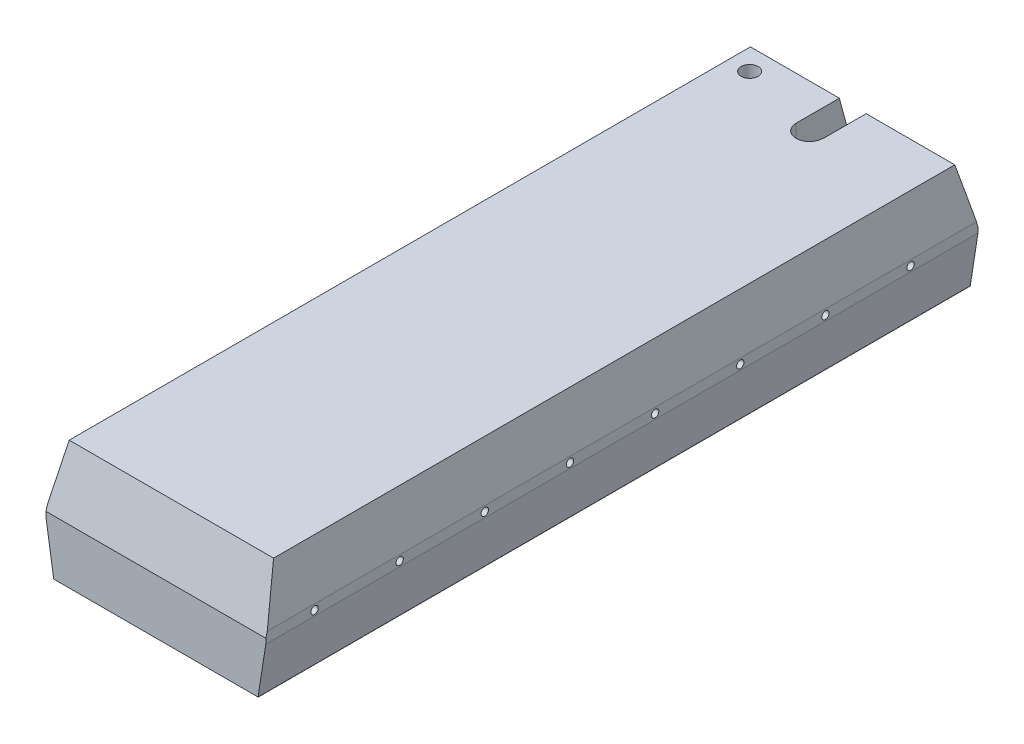
ISO-10303-21;
HEADER;
FILE_DESCRIPTION(('STEP AP214'),'2;1');
FILE_NAME('part.step','',(''),(''),'','','');
FILE_SCHEMA(('AUTOMOTIVE_DESIGN { 1 0 10303 214 1 1 1 1 }'));
ENDSEC;
DATA;
#1=APPLICATION_CONTEXT('core data for automotive mechanical design processes');
#2=APPLICATION_PROTOCOL_DEFINITION('international standard','automotive_design',2000,#1);
#3=PRODUCT_CONTEXT('',#1,'mechanical');
#4=PRODUCT('Part','Part','',(#3));
#5=PRODUCT_RELATED_PRODUCT_CATEGORY('part','',(#4));
#6=PRODUCT_DEFINITION_FORMATION('','',#4);
#7=PRODUCT_DEFINITION_CONTEXT('part definition',#1,'design');
#8=PRODUCT_DEFINITION('design','',#6,#7);
#9=PRODUCT_DEFINITION_SHAPE('','',#8);
#10=(LENGTH_UNIT() NAMED_UNIT(*) SI_UNIT(.MILLI.,.METRE.));
#11=(NAMED_UNIT(*) PLANE_ANGLE_UNIT() SI_UNIT($,.RADIAN.));
#12=(NAMED_UNIT(*) SI_UNIT($,.STERADIAN.) SOLID_ANGLE_UNIT());
#13=UNCERTAINTY_MEASURE_WITH_UNIT(LENGTH_MEASURE(1.E-05),#10,'distance_accuracy_value','');
#14=(GEOMETRIC_REPRESENTATION_CONTEXT(3) GLOBAL_UNCERTAINTY_ASSIGNED_CONTEXT((#13)) GLOBAL_UNIT_ASSIGNED_CONTEXT((#10,
#11,#12)) REPRESENTATION_CONTEXT('',''));
#15=CARTESIAN_POINT('',(0.,0.,0.));
#16=DIRECTION('',(0.,0.,1.));
#17=DIRECTION('',(1.,0.,0.));
#18=AXIS2_PLACEMENT_3D('',#15,#16,#17);
#19=CARTESIAN_POINT('',(1.7265748977661,5.79398536682129,-17.3326766490936));
#20=DIRECTION('',(0.,1.,0.));
#21=DIRECTION('',(0.,0.,1.));
#22=AXIS2_PLACEMENT_3D('',#19,#20,#21);
#23=PLANE('',#22);
#24=CARTESIAN_POINT('',(1.7265748977661,5.79398536682129,-17.3326766490936));
#25=DIRECTION('',(0.,-1.,0.));
#26=DIRECTION('',(0.,0.,-1.));
#27=AXIS2_PLACEMENT_3D('',#24,#25,#26);
#28=CIRCLE('',#27,0.499999999999999);
#29=CARTESIAN_POINT('',(1.7265748977661,5.79398536682129,-17.8326766490936));
#30=VERTEX_POINT('',#29);
#31=EDGE_CURVE('E20',#30,#30,#28,.F.);
#32=ORIENTED_EDGE('',*,*,#31,.T.);
#33=EDGE_LOOP('',(#32));
#34=FACE_BOUND('',#33,.T.);
#35=ADVANCED_FACE('F17',(#34),#23,.T.);
#36=CARTESIAN_POINT('',(7.28615480415629,6.79398536682129,-16.0697424411774));
#37=DIRECTION('',(0.,0.,1.));
#38=DIRECTION('',(1.,0.,0.));
#39=AXIS2_PLACEMENT_3D('',#36,#37,#38);
#40=PLANE('',#39);
#41=DIRECTION('',(0.,-1.,0.));
#42=VECTOR('',#41,1.);
#43=CARTESIAN_POINT('',(7.2768995712719,6.79398536682129,-16.0697424411774));
#44=LINE('',#43,#42);
#45=CARTESIAN_POINT('',(7.2768995712719,4.79398536682129,-16.0697424411774));
#46=VERTEX_POINT('',#45);
#47=CARTESIAN_POINT('',(7.2768995712719,6.79398536682129,-16.0697424411774));
#48=VERTEX_POINT('',#47);
#49=EDGE_CURVE('E142',#46,#48,#44,.F.);
#50=ORIENTED_EDGE('',*,*,#49,.T.);
#51=DIRECTION('',(1.,0.,0.));
#52=VECTOR('',#51,1.);
#53=CARTESIAN_POINT('',(7.28615480415629,6.79398536682129,-16.0697424411774));
#54=LINE('',#53,#52);
#55=CARTESIAN_POINT('',(7.29541003704069,6.79398536682129,-16.0697424411774));
#56=VERTEX_POINT('',#55);
#57=EDGE_CURVE('E185',#56,#48,#54,.F.);
#58=ORIENTED_EDGE('',*,*,#57,.F.);
#59=DIRECTION('',(0.,1.,0.));
#60=VECTOR('',#59,1.);
#61=CARTESIAN_POINT('',(7.29541003704069,6.79398536682129,-16.0697424411774));
#62=LINE('',#61,#60);
#63=CARTESIAN_POINT('',(7.29541003704069,4.79398536682129,-16.0697424411774));
#64=VERTEX_POINT('',#63);
#65=EDGE_CURVE('E145',#56,#64,#62,.F.);
#66=ORIENTED_EDGE('',*,*,#65,.T.);
#67=DIRECTION('',(1.,0.,0.));
#68=VECTOR('',#67,1.);
#69=CARTESIAN_POINT('',(6.50874662313626,4.79398536682129,-16.0697424411774));
#70=LINE('',#69,#68);
#71=EDGE_CURVE('E139',#46,#64,#70,.T.);
#72=ORIENTED_EDGE('',*,*,#71,.F.);
#73=EDGE_LOOP('',(#50,#58,#66,#72));
#74=FACE_BOUND('',#73,.T.);
#75=ADVANCED_FACE('F140',(#74),#40,.F.);
#76=CARTESIAN_POINT('',(6.50874662313626,4.79398536682129,-18.8628559020372));
#77=DIRECTION('',(0.,1.,0.));
#78=DIRECTION('',(0.,0.,1.));
#79=AXIS2_PLACEMENT_3D('',#76,#77,#78);
#80=PLANE('',#79);
#81=ORIENTED_EDGE('',*,*,#71,.T.);
#82=DIRECTION('',(0.,0.,-1.));
#83=VECTOR('',#82,1.);
#84=CARTESIAN_POINT('',(7.29541003704069,4.79398536682129,-19.0966314077377));
#85=LINE('',#84,#83);
#86=CARTESIAN_POINT('',(7.29541003704069,4.79398536682129,-19.1420509193472));
#87=VERTEX_POINT('',#86);
#88=EDGE_CURVE('E192',#64,#87,#85,.T.);
#89=ORIENTED_EDGE('',*,*,#88,.T.);
#90=DIRECTION('',(1.,0.,0.));
#91=VECTOR('',#90,1.);
#92=CARTESIAN_POINT('',(6.50874662313626,4.79398536682129,-19.1420509193472));
#93=LINE('',#92,#91);
#94=CARTESIAN_POINT('',(5.72310042872811,4.79398536682128,-19.1420509193472));
#95=VERTEX_POINT('',#94);
#96=EDGE_CURVE('E148',#87,#95,#93,.F.);
#97=ORIENTED_EDGE('',*,*,#96,.T.);
#98=DIRECTION('',(0.,0.,1.));
#99=VECTOR('',#98,1.);
#100=CARTESIAN_POINT('',(5.72310042872811,4.79398536682129,-19.0966314077377));
#101=LINE('',#100,#99);
#102=CARTESIAN_POINT('',(5.72310042872811,4.79398536682129,-16.0697424411774));
#103=VERTEX_POINT('',#102);
#104=EDGE_CURVE('E133',#95,#103,#101,.T.);
#105=ORIENTED_EDGE('',*,*,#104,.T.);
#106=CARTESIAN_POINT('',(6.5,4.79398536682129,-16.0697424411774));
#107=DIRECTION('',(0.,-1.,0.));
#108=DIRECTION('',(0.,0.,-1.));
#109=AXIS2_PLACEMENT_3D('',#106,#107,#108);
#110=CIRCLE('',#109,0.776899571271895);
#111=EDGE_CURVE('E150',#103,#46,#110,.F.);
#112=ORIENTED_EDGE('',*,*,#111,.T.);
#113=EDGE_LOOP('',(#81,#89,#97,#105,#112));
#114=FACE_BOUND('',#113,.T.);
#115=ADVANCED_FACE('F151',(#114),#80,.T.);
#116=CARTESIAN_POINT('',(-44.2885988895638,3.4006376749442,14.4430922391916));
#117=DIRECTION('',(1.,0.,0.));
#118=DIRECTION('',(0.,0.,-1.));
#119=AXIS2_PLACEMENT_3D('',#116,#117,#118);
#120=CYLINDRICAL_SURFACE('',#119,0.217699812941596);
#121=CARTESIAN_POINT('',(0.0470726490020903,3.4006376749442,14.4430922391916));
#122=DIRECTION('',(1.,0.,0.));
#123=DIRECTION('',(0.,0.,-1.));
#124=AXIS2_PLACEMENT_3D('',#121,#122,#123);
#125=CIRCLE('',#124,0.217699812941596);
#126=CARTESIAN_POINT('',(0.0470726490020903,3.4006376749442,14.22539242625));
#127=VERTEX_POINT('',#126);
#128=EDGE_CURVE('E196',#127,#127,#125,.F.);
#129=ORIENTED_EDGE('',*,*,#128,.T.);
#130=EDGE_LOOP('',(#129));
#131=FACE_BOUND('',#130,.T.);
#132=CARTESIAN_POINT('',(12.9529273509979,3.4006376749442,14.4430922391916));
#133=DIRECTION('',(1.,0.,0.));
#134=DIRECTION('',(0.,0.,-1.));
#135=AXIS2_PLACEMENT_3D('',#132,#133,#134);
#136=CIRCLE('',#135,0.217699812941596);
#137=CARTESIAN_POINT('',(12.9529273509979,3.4006376749442,14.22539242625));
#138=VERTEX_POINT('',#137);
#139=EDGE_CURVE('E239',#138,#138,#136,.T.);
#140=ORIENTED_EDGE('',*,*,#139,.T.);
#141=EDGE_LOOP('',(#140));
#142=FACE_BOUND('',#141,.T.);
#143=ADVANCED_FACE('F267',(#131,#142),#120,.F.);
#144=CARTESIAN_POINT('',(-44.2885988895638,3.4006376749442,4.44309223919162));
#145=DIRECTION('',(1.,0.,0.));
#146=DIRECTION('',(0.,0.,-1.));
#147=AXIS2_PLACEMENT_3D('',#144,#145,#146);
#148=CYLINDRICAL_SURFACE('',#147,0.217699812941596);
#149=CARTESIAN_POINT('',(0.0470726490020903,3.4006376749442,4.44309223919162));
#150=DIRECTION('',(1.,0.,0.));
#151=DIRECTION('',(0.,0.,-1.));
#152=AXIS2_PLACEMENT_3D('',#149,#150,#151);
#153=CIRCLE('',#152,0.217699812941596);
#154=CARTESIAN_POINT('',(0.0470726490020903,3.4006376749442,4.22539242625002));
#155=VERTEX_POINT('',#154);
#156=EDGE_CURVE('E261',#155,#155,#153,.F.);
#157=ORIENTED_EDGE('',*,*,#156,.T.);
#158=EDGE_LOOP('',(#157));
#159=FACE_BOUND('',#158,.T.);
#160=CARTESIAN_POINT('',(12.9529273509979,3.4006376749442,4.44309223919162));
#161=DIRECTION('',(1.,0.,0.));
#162=DIRECTION('',(0.,0.,-1.));
#163=AXIS2_PLACEMENT_3D('',#160,#161,#162);
#164=CIRCLE('',#163,0.217699812941596);
#165=CARTESIAN_POINT('',(12.9529273509979,3.4006376749442,4.22539242625002));
#166=VERTEX_POINT('',#165);
#167=EDGE_CURVE('E236',#166,#166,#164,.T.);
#168=ORIENTED_EDGE('',*,*,#167,.T.);
#169=EDGE_LOOP('',(#168));
#170=FACE_BOUND('',#169,.T.);
#171=ADVANCED_FACE('F469',(#159,#170),#148,.F.);
#172=CARTESIAN_POINT('',(-44.2885988895638,3.4006376749442,-5.55690776080839));
#173=DIRECTION('',(1.,0.,0.));
#174=DIRECTION('',(0.,0.,-1.));
#175=AXIS2_PLACEMENT_3D('',#172,#173,#174);
#176=CYLINDRICAL_SURFACE('',#175,0.217699812941596);
#177=CARTESIAN_POINT('',(0.0470726490020903,3.4006376749442,-5.55690776080839));
#178=DIRECTION('',(1.,0.,0.));
#179=DIRECTION('',(0.,0.,-1.));
#180=AXIS2_PLACEMENT_3D('',#177,#178,#179);
#181=CIRCLE('',#180,0.217699812941596);
#182=CARTESIAN_POINT('',(0.0470726490020903,3.4006376749442,-5.77460757374999));
#183=VERTEX_POINT('',#182);
#184=EDGE_CURVE('E258',#183,#183,#181,.F.);
#185=ORIENTED_EDGE('',*,*,#184,.T.);
#186=EDGE_LOOP('',(#185));
#187=FACE_BOUND('',#186,.T.);
#188=CARTESIAN_POINT('',(12.9529273509979,3.4006376749442,-5.55690776080839));
#189=DIRECTION('',(1.,0.,0.));
#190=DIRECTION('',(0.,0.,-1.));
#191=AXIS2_PLACEMENT_3D('',#188,#189,#190);
#192=CIRCLE('',#191,0.217699812941596);
#193=CARTESIAN_POINT('',(12.9529273509979,3.4006376749442,-5.77460757374999));
#194=VERTEX_POINT('',#193);
#195=EDGE_CURVE('E233',#194,#194,#192,.T.);
#196=ORIENTED_EDGE('',*,*,#195,.T.);
#197=EDGE_LOOP('',(#196));
#198=FACE_BOUND('',#197,.T.);
#199=ADVANCED_FACE('F465',(#187,#198),#176,.F.);
#200=CARTESIAN_POINT('',(-44.2885988895638,3.4006376749442,-15.5569077608084));
#201=DIRECTION('',(1.,0.,0.));
#202=DIRECTION('',(0.,0.,-1.));
#203=AXIS2_PLACEMENT_3D('',#200,#201,#202);
#204=CYLINDRICAL_SURFACE('',#203,0.217699812941596);
#205=CARTESIAN_POINT('',(0.0470726490020903,3.4006376749442,-15.5569077608084));
#206=DIRECTION('',(1.,0.,0.));
#207=DIRECTION('',(0.,0.,-1.));
#208=AXIS2_PLACEMENT_3D('',#205,#206,#207);
#209=CIRCLE('',#208,0.217699812941596);
#210=CARTESIAN_POINT('',(0.0470726490020903,3.4006376749442,-15.77460757375));
#211=VERTEX_POINT('',#210);
#212=EDGE_CURVE('E255',#211,#211,#209,.F.);
#213=ORIENTED_EDGE('',*,*,#212,.T.);
#214=EDGE_LOOP('',(#213));
#215=FACE_BOUND('',#214,.T.);
#216=CARTESIAN_POINT('',(12.9529273509979,3.4006376749442,-15.5569077608084));
#217=DIRECTION('',(1.,0.,0.));
#218=DIRECTION('',(0.,0.,-1.));
#219=AXIS2_PLACEMENT_3D('',#216,#217,#218);
#220=CIRCLE('',#219,0.217699812941596);
#221=CARTESIAN_POINT('',(12.9529273509979,3.4006376749442,-15.77460757375));
#222=VERTEX_POINT('',#221);
#223=EDGE_CURVE('E230',#222,#222,#220,.T.);
#224=ORIENTED_EDGE('',*,*,#223,.T.);
#225=EDGE_LOOP('',(#224));
#226=FACE_BOUND('',#225,.T.);
#227=ADVANCED_FACE('F461',(#215,#226),#204,.F.);
#228=CARTESIAN_POINT('',(-44.2885988895638,3.4006376749442,-10.5569077608084));
#229=DIRECTION('',(1.,0.,0.));
#230=DIRECTION('',(0.,0.,-1.));
#231=AXIS2_PLACEMENT_3D('',#228,#229,#230);
#232=CYLINDRICAL_SURFACE('',#231,0.217699812941596);
#233=CARTESIAN_POINT('',(0.0470726490020903,3.4006376749442,-10.5569077608084));
#234=DIRECTION('',(1.,0.,0.));
#235=DIRECTION('',(0.,0.,-1.));
#236=AXIS2_PLACEMENT_3D('',#233,#234,#235);
#237=CIRCLE('',#236,0.217699812941596);
#238=CARTESIAN_POINT('',(0.0470726490020903,3.4006376749442,-10.77460757375));
#239=VERTEX_POINT('',#238);
#240=EDGE_CURVE('E252',#239,#239,#237,.F.);
#241=ORIENTED_EDGE('',*,*,#240,.T.);
#242=EDGE_LOOP('',(#241));
#243=FACE_BOUND('',#242,.T.);
#244=CARTESIAN_POINT('',(12.9529273509979,3.4006376749442,-10.5569077608084));
#245=DIRECTION('',(1.,0.,0.));
#246=DIRECTION('',(0.,0.,-1.));
#247=AXIS2_PLACEMENT_3D('',#244,#245,#246);
#248=CIRCLE('',#247,0.217699812941596);
#249=CARTESIAN_POINT('',(12.9529273509979,3.4006376749442,-10.77460757375));
#250=VERTEX_POINT('',#249);
#251=EDGE_CURVE('E227',#250,#250,#248,.T.);
#252=ORIENTED_EDGE('',*,*,#251,.T.);
#253=EDGE_LOOP('',(#252));
#254=FACE_BOUND('',#253,.T.);
#255=ADVANCED_FACE('F457',(#243,#254),#232,.F.);
#256=CARTESIAN_POINT('',(-44.2885988895638,3.4006376749442,-0.556907760808385));
#257=DIRECTION('',(1.,0.,0.));
#258=DIRECTION('',(0.,0.,-1.));
#259=AXIS2_PLACEMENT_3D('',#256,#257,#258);
#260=CYLINDRICAL_SURFACE('',#259,0.217699812941596);
#261=CARTESIAN_POINT('',(0.0470726490020903,3.4006376749442,-0.556907760808385));
#262=DIRECTION('',(1.,0.,0.));
#263=DIRECTION('',(0.,0.,-1.));
#264=AXIS2_PLACEMENT_3D('',#261,#262,#263);
#265=CIRCLE('',#264,0.217699812941596);
#266=CARTESIAN_POINT('',(0.0470726490020903,3.4006376749442,-0.774607573749981));
#267=VERTEX_POINT('',#266);
#268=EDGE_CURVE('E249',#267,#267,#265,.F.);
#269=ORIENTED_EDGE('',*,*,#268,.T.);
#270=EDGE_LOOP('',(#269));
#271=FACE_BOUND('',#270,.T.);
#272=CARTESIAN_POINT('',(12.9529273509979,3.4006376749442,-0.556907760808385));
#273=DIRECTION('',(1.,0.,0.));
#274=DIRECTION('',(0.,0.,-1.));
#275=AXIS2_PLACEMENT_3D('',#272,#273,#274);
#276=CIRCLE('',#275,0.217699812941596);
#277=CARTESIAN_POINT('',(12.9529273509979,3.4006376749442,-0.774607573749981));
#278=VERTEX_POINT('',#277);
#279=EDGE_CURVE('E224',#278,#278,#276,.T.);
#280=ORIENTED_EDGE('',*,*,#279,.T.);
#281=EDGE_LOOP('',(#280));
#282=FACE_BOUND('',#281,.T.);
#283=ADVANCED_FACE('F453',(#271,#282),#260,.F.);
#284=CARTESIAN_POINT('',(-44.2885988895638,3.4006376749442,9.44309223919162));
#285=DIRECTION('',(1.,0.,0.));
#286=DIRECTION('',(0.,0.,-1.));
#287=AXIS2_PLACEMENT_3D('',#284,#285,#286);
#288=CYLINDRICAL_SURFACE('',#287,0.217699812941596);
#289=CARTESIAN_POINT('',(0.0470726490020903,3.4006376749442,9.44309223919162));
#290=DIRECTION('',(1.,0.,0.));
#291=DIRECTION('',(0.,0.,-1.));
#292=AXIS2_PLACEMENT_3D('',#289,#290,#291);
#293=CIRCLE('',#292,0.217699812941596);
#294=CARTESIAN_POINT('',(0.0470726490020903,3.4006376749442,9.22539242625002));
#295=VERTEX_POINT('',#294);
#296=EDGE_CURVE('E246',#295,#295,#293,.F.);
#297=ORIENTED_EDGE('',*,*,#296,.T.);
#298=EDGE_LOOP('',(#297));
#299=FACE_BOUND('',#298,.T.);
#300=CARTESIAN_POINT('',(12.9529273509979,3.4006376749442,9.44309223919162));
#301=DIRECTION('',(1.,0.,0.));
#302=DIRECTION('',(0.,0.,-1.));
#303=AXIS2_PLACEMENT_3D('',#300,#301,#302);
#304=CIRCLE('',#303,0.217699812941596);
#305=CARTESIAN_POINT('',(12.9529273509979,3.4006376749442,9.22539242625002));
#306=VERTEX_POINT('',#305);
#307=EDGE_CURVE('E221',#306,#306,#304,.T.);
#308=ORIENTED_EDGE('',*,*,#307,.T.);
#309=EDGE_LOOP('',(#308));
#310=FACE_BOUND('',#309,.T.);
#311=ADVANCED_FACE('F449',(#299,#310),#288,.F.);
#312=CARTESIAN_POINT('',(-44.2885988895638,3.4006376749442,19.4430922391916));
#313=DIRECTION('',(1.,0.,0.));
#314=DIRECTION('',(0.,0.,-1.));
#315=AXIS2_PLACEMENT_3D('',#312,#313,#314);
#316=CYLINDRICAL_SURFACE('',#315,0.217699812941596);
#317=CARTESIAN_POINT('',(0.0470726490020903,3.4006376749442,19.4430922391916));
#318=DIRECTION('',(1.,0.,0.));
#319=DIRECTION('',(0.,0.,-1.));
#320=AXIS2_PLACEMENT_3D('',#317,#318,#319);
#321=CIRCLE('',#320,0.217699812941596);
#322=CARTESIAN_POINT('',(0.0470726490020903,3.4006376749442,19.22539242625));
#323=VERTEX_POINT('',#322);
#324=EDGE_CURVE('E243',#323,#323,#321,.F.);
#325=ORIENTED_EDGE('',*,*,#324,.T.);
#326=EDGE_LOOP('',(#325));
#327=FACE_BOUND('',#326,.T.);
#328=CARTESIAN_POINT('',(12.9529273509979,3.4006376749442,19.4430922391916));
#329=DIRECTION('',(1.,0.,0.));
#330=DIRECTION('',(0.,0.,-1.));
#331=AXIS2_PLACEMENT_3D('',#328,#329,#330);
#332=CIRCLE('',#331,0.217699812941596);
#333=CARTESIAN_POINT('',(12.9529273509979,3.4006376749442,19.22539242625));
#334=VERTEX_POINT('',#333);
#335=EDGE_CURVE('E217',#334,#334,#332,.T.);
#336=ORIENTED_EDGE('',*,*,#335,.T.);
#337=EDGE_LOOP('',(#336));
#338=FACE_BOUND('',#337,.T.);
#339=ADVANCED_FACE('F445',(#327,#338),#316,.F.);
#340=CARTESIAN_POINT('',(1.7265748977661,6.79398536682129,-17.3326766490936));
#341=DIRECTION('',(0.,-1.,0.));
#342=DIRECTION('',(0.,0.,-1.));
#343=AXIS2_PLACEMENT_3D('',#340,#341,#342);
#344=CYLINDRICAL_SURFACE('',#343,0.499999999999999);
#345=CARTESIAN_POINT('',(1.7265748977661,6.79398536682129,-17.3326766490936));
#346=DIRECTION('',(0.,-1.,0.));
#347=DIRECTION('',(0.,0.,-1.));
#348=AXIS2_PLACEMENT_3D('',#345,#346,#347);
#349=CIRCLE('',#348,0.499999999999999);
#350=CARTESIAN_POINT('',(1.7265748977661,6.79398536682129,-17.8326766490936));
#351=VERTEX_POINT('',#350);
#352=EDGE_CURVE('E212',#351,#351,#349,.T.);
#353=ORIENTED_EDGE('',*,*,#352,.F.);
#354=EDGE_LOOP('',(#353));
#355=FACE_BOUND('',#354,.T.);
#356=ORIENTED_EDGE('',*,*,#31,.F.);
#357=EDGE_LOOP('',(#356));
#358=FACE_BOUND('',#357,.T.);
#359=ADVANCED_FACE('F440',(#355,#358),#344,.F.);
#360=CARTESIAN_POINT('',(6.5,6.79398536682129,-16.0697424411774));
#361=DIRECTION('',(0.,-1.,0.));
#362=DIRECTION('',(0.,0.,-1.));
#363=AXIS2_PLACEMENT_3D('',#360,#361,#362);
#364=CYLINDRICAL_SURFACE('',#363,0.776899571271895);
#365=DIRECTION('',(0.,1.,0.));
#366=VECTOR('',#365,1.);
#367=CARTESIAN_POINT('',(5.72310042872811,6.79398536682129,-16.0697424411774));
#368=LINE('',#367,#366);
#369=CARTESIAN_POINT('',(5.72310042872811,6.79398536682129,-16.0697424411774));
#370=VERTEX_POINT('',#369);
#371=EDGE_CURVE('E163',#103,#370,#368,.T.);
#372=ORIENTED_EDGE('',*,*,#371,.T.);
#373=CARTESIAN_POINT('',(6.5,6.79398536682129,-16.0697424411774));
#374=DIRECTION('',(0.,-1.,0.));
#375=DIRECTION('',(0.,0.,-1.));
#376=AXIS2_PLACEMENT_3D('',#373,#374,#375);
#377=CIRCLE('',#376,0.776899571271895);
#378=EDGE_CURVE('E156',#48,#370,#377,.T.);
#379=ORIENTED_EDGE('',*,*,#378,.F.);
#380=ORIENTED_EDGE('',*,*,#49,.F.);
#381=ORIENTED_EDGE('',*,*,#111,.F.);
#382=EDGE_LOOP('',(#372,#379,#380,#381));
#383=FACE_BOUND('',#382,.T.);
#384=ADVANCED_FACE('F154',(#383),#364,.F.);
#385=CARTESIAN_POINT('',(5.72310042872811,6.79398536682129,-19.0966314077377));
#386=DIRECTION('',(-1.,0.,0.));
#387=DIRECTION('',(0.,0.,1.));
#388=AXIS2_PLACEMENT_3D('',#385,#386,#387);
#389=PLANE('',#388);
#390=DIRECTION('',(0.,0.,1.));
#391=VECTOR('',#390,1.);
#392=CARTESIAN_POINT('',(5.72310042872811,6.79398536682129,1.3938474655151));
#393=LINE('',#392,#391);
#394=CARTESIAN_POINT('',(5.72310042872811,6.79398536682129,-18.6061525344849));
#395=VERTEX_POINT('',#394);
#396=EDGE_CURVE('E215',#370,#395,#393,.F.);
#397=ORIENTED_EDGE('',*,*,#396,.F.);
#398=ORIENTED_EDGE('',*,*,#371,.F.);
#399=ORIENTED_EDGE('',*,*,#104,.F.);
#400=DIRECTION('',(0.,0.965925826289067,0.258819045102525));
#401=VECTOR('',#400,1.);
#402=CARTESIAN_POINT('',(5.72310042872811,5.09731152088274,-19.0607749213231));
#403=LINE('',#402,#401);
#404=EDGE_CURVE('E165',#395,#95,#403,.F.);
#405=ORIENTED_EDGE('',*,*,#404,.F.);
#406=EDGE_LOOP('',(#397,#398,#399,#405));
#407=FACE_BOUND('',#406,.T.);
#408=ADVANCED_FACE('F284',(#407),#389,.F.);
#409=CARTESIAN_POINT('',(7.29541003704069,6.79398536682129,-19.0966314077377));
#410=DIRECTION('',(1.,0.,0.));
#411=DIRECTION('',(0.,0.,-1.));
#412=AXIS2_PLACEMENT_3D('',#409,#410,#411);
#413=PLANE('',#412);
#414=ORIENTED_EDGE('',*,*,#88,.F.);
#415=ORIENTED_EDGE('',*,*,#65,.F.);
#416=DIRECTION('',(0.,0.,1.));
#417=VECTOR('',#416,1.);
#418=CARTESIAN_POINT('',(7.29541003704069,6.79398536682129,1.3938474655151));
#419=LINE('',#418,#417);
#420=CARTESIAN_POINT('',(7.29541003704069,6.79398536682129,-18.6061525344849));
#421=VERTEX_POINT('',#420);
#422=EDGE_CURVE('E204',#421,#56,#419,.T.);
#423=ORIENTED_EDGE('',*,*,#422,.F.);
#424=DIRECTION('',(0.,0.965925826289067,0.258819045102525));
#425=VECTOR('',#424,1.);
#426=CARTESIAN_POINT('',(7.29541003704069,5.09731152088274,-19.0607749213231));
#427=LINE('',#426,#425);
#428=EDGE_CURVE('E168',#87,#421,#427,.T.);
#429=ORIENTED_EDGE('',*,*,#428,.F.);
#430=EDGE_LOOP('',(#414,#415,#423,#429));
#431=FACE_BOUND('',#430,.T.);
#432=ADVANCED_FACE('F273',(#431),#413,.F.);
#433=CARTESIAN_POINT('',(0.0470726490020934,3.37544463574888,-22.7858184459392));
#434=DIRECTION('',(1.,0.,0.));
#435=DIRECTION('',(0.,0.,-1.));
#436=AXIS2_PLACEMENT_3D('',#433,#434,#435);
#437=PLANE('',#436);
#438=DIRECTION('',(0.,0.965925826289067,0.258819045102525));
#439=VECTOR('',#438,1.);
#440=CARTESIAN_POINT('',(0.0470726490020934,5.09731152088274,-19.0607749213231));
#441=LINE('',#440,#439);
#442=CARTESIAN_POINT('',(0.0470726490020934,3.40063767494419,-19.5153973081614));
#443=VERTEX_POINT('',#442);
#444=CARTESIAN_POINT('',(0.0470726490020936,3.7201054046278,-19.4297961879849));
#445=VERTEX_POINT('',#444);
#446=EDGE_CURVE('E427',#443,#445,#441,.T.);
#447=ORIENTED_EDGE('',*,*,#446,.F.);
#448=DIRECTION('',(0.,1.,0.));
#449=VECTOR('',#448,1.);
#450=CARTESIAN_POINT('',(0.0470726490020934,3.37544463574888,-19.5153973081614));
#451=LINE('',#450,#449);
#452=CARTESIAN_POINT('',(0.0470726490020936,3.09818026917274,-19.5153973081614));
#453=VERTEX_POINT('',#452);
#454=EDGE_CURVE('E242',#453,#443,#451,.T.);
#455=ORIENTED_EDGE('',*,*,#454,.F.);
#456=DIRECTION('',(0.,0.,1.));
#457=VECTOR('',#456,1.);
#458=CARTESIAN_POINT('',(0.0470726490020948,3.09818026917274,25.2971146292048));
#459=LINE('',#458,#457);
#460=CARTESIAN_POINT('',(0.0470726490020937,3.09818026917274,22.3030922391916));
#461=VERTEX_POINT('',#460);
#462=EDGE_CURVE('E175',#453,#461,#459,.T.);
#463=ORIENTED_EDGE('',*,*,#462,.T.);
#464=DIRECTION('',(0.,1.,0.));
#465=VECTOR('',#464,1.);
#466=CARTESIAN_POINT('',(0.0470726490020934,3.37544463574888,22.3030922391916));
#467=LINE('',#466,#465);
#468=CARTESIAN_POINT('',(0.0470726490020934,3.40063767494419,22.3030922391916));
#469=VERTEX_POINT('',#468);
#470=EDGE_CURVE('E370',#469,#461,#467,.F.);
#471=ORIENTED_EDGE('',*,*,#470,.F.);
#472=DIRECTION('',(0.,-0.965925826289082,0.25881904510247));
#473=VECTOR('',#472,1.);
#474=CARTESIAN_POINT('',(0.0470726490020934,3.72010540462781,22.2174911190151));
#475=LINE('',#474,#473);
#476=CARTESIAN_POINT('',(0.0470726490020935,3.72010540462781,22.2174911190151));
#477=VERTEX_POINT('',#476);
#478=EDGE_CURVE('E161',#477,#469,#475,.T.);
#479=ORIENTED_EDGE('',*,*,#478,.F.);
#480=DIRECTION('',(0.,0.,1.));
#481=VECTOR('',#480,1.);
#482=CARTESIAN_POINT('',(0.047072649002094,3.72010540462781,25.2971146292048));
#483=LINE('',#482,#481);
#484=EDGE_CURVE('E169',#477,#445,#483,.F.);
#485=ORIENTED_EDGE('',*,*,#484,.T.);
#486=EDGE_LOOP('',(#447,#455,#463,#471,#479,#485));
#487=FACE_BOUND('',#486,.T.);
#488=ORIENTED_EDGE('',*,*,#324,.F.);
#489=EDGE_LOOP('',(#488));
#490=FACE_BOUND('',#489,.T.);
#491=ORIENTED_EDGE('',*,*,#296,.F.);
#492=EDGE_LOOP('',(#491));
#493=FACE_BOUND('',#492,.T.);
#494=ORIENTED_EDGE('',*,*,#268,.F.);
#495=EDGE_LOOP('',(#494));
#496=FACE_BOUND('',#495,.T.);
#497=ORIENTED_EDGE('',*,*,#240,.F.);
#498=EDGE_LOOP('',(#497));
#499=FACE_BOUND('',#498,.T.);
#500=ORIENTED_EDGE('',*,*,#212,.F.);
#501=EDGE_LOOP('',(#500));
#502=FACE_BOUND('',#501,.T.);
#503=ORIENTED_EDGE('',*,*,#184,.F.);
#504=EDGE_LOOP('',(#503));
#505=FACE_BOUND('',#504,.T.);
#506=ORIENTED_EDGE('',*,*,#156,.F.);
#507=EDGE_LOOP('',(#506));
#508=FACE_BOUND('',#507,.T.);
#509=ORIENTED_EDGE('',*,*,#128,.F.);
#510=EDGE_LOOP('',(#509));
#511=FACE_BOUND('',#510,.T.);
#512=ADVANCED_FACE('F270',(#487,#490,#493,#496,#499,#502,#505,#508,#511),#437,.F.);
#513=CARTESIAN_POINT('',(12.9529273509979,3.37544463574888,-22.7858184459392));
#514=DIRECTION('',(-1.,0.,0.));
#515=DIRECTION('',(0.,0.,1.));
#516=AXIS2_PLACEMENT_3D('',#513,#514,#515);
#517=PLANE('',#516);
#518=DIRECTION('',(0.,1.,0.));
#519=VECTOR('',#518,1.);
#520=CARTESIAN_POINT('',(12.9529273509979,3.37544463574888,-19.5153973081614));
#521=LINE('',#520,#519);
#522=CARTESIAN_POINT('',(12.9529273509979,3.40063767494419,-19.5153973081614));
#523=VERTEX_POINT('',#522);
#524=CARTESIAN_POINT('',(12.9529273509979,3.09818026917269,-19.5153973081614));
#525=VERTEX_POINT('',#524);
#526=EDGE_CURVE('E365',#523,#525,#521,.F.);
#527=ORIENTED_EDGE('',*,*,#526,.F.);
#528=DIRECTION('',(0.,0.965925826289067,0.258819045102525));
#529=VECTOR('',#528,1.);
#530=CARTESIAN_POINT('',(12.9529273509979,5.09731152088274,-19.0607749213231));
#531=LINE('',#530,#529);
#532=CARTESIAN_POINT('',(12.9529273509979,3.72010540462785,-19.4297961879849));
#533=VERTEX_POINT('',#532);
#534=EDGE_CURVE('E349',#533,#523,#531,.F.);
#535=ORIENTED_EDGE('',*,*,#534,.F.);
#536=DIRECTION('',(0.,0.,1.));
#537=VECTOR('',#536,1.);
#538=CARTESIAN_POINT('',(12.9529273509979,3.72010540462785,25.2971146292048));
#539=LINE('',#538,#537);
#540=CARTESIAN_POINT('',(12.9529273509979,3.72010540462785,22.2174911190151));
#541=VERTEX_POINT('',#540);
#542=EDGE_CURVE('E216',#533,#541,#539,.T.);
#543=ORIENTED_EDGE('',*,*,#542,.T.);
#544=DIRECTION('',(0.,0.96592582628909,-0.25881904510244));
#545=VECTOR('',#544,1.);
#546=CARTESIAN_POINT('',(12.9529273509979,3.40063767494419,22.3030922391916));
#547=LINE('',#546,#545);
#548=CARTESIAN_POINT('',(12.9529273509979,3.40063767494419,22.3030922391916));
#549=VERTEX_POINT('',#548);
#550=EDGE_CURVE('E367',#549,#541,#547,.T.);
#551=ORIENTED_EDGE('',*,*,#550,.F.);
#552=DIRECTION('',(0.,1.,0.));
#553=VECTOR('',#552,1.);
#554=CARTESIAN_POINT('',(12.9529273509979,3.37544463574888,22.3030922391916));
#555=LINE('',#554,#553);
#556=CARTESIAN_POINT('',(12.9529273509979,3.09818026917269,22.3030922391916));
#557=VERTEX_POINT('',#556);
#558=EDGE_CURVE('E220',#557,#549,#555,.T.);
#559=ORIENTED_EDGE('',*,*,#558,.F.);
#560=DIRECTION('',(0.,0.,1.));
#561=VECTOR('',#560,1.);
#562=CARTESIAN_POINT('',(12.9529273509979,3.09818026917269,25.2971146292048));
#563=LINE('',#562,#561);
#564=EDGE_CURVE('E391',#557,#525,#563,.F.);
#565=ORIENTED_EDGE('',*,*,#564,.T.);
#566=EDGE_LOOP('',(#527,#535,#543,#551,#559,#565));
#567=FACE_BOUND('',#566,.T.);
#568=ORIENTED_EDGE('',*,*,#335,.F.);
#569=EDGE_LOOP('',(#568));
#570=FACE_BOUND('',#569,.T.);
#571=ORIENTED_EDGE('',*,*,#307,.F.);
#572=EDGE_LOOP('',(#571));
#573=FACE_BOUND('',#572,.T.);
#574=ORIENTED_EDGE('',*,*,#279,.F.);
#575=EDGE_LOOP('',(#574));
#576=FACE_BOUND('',#575,.T.);
#577=ORIENTED_EDGE('',*,*,#251,.F.);
#578=EDGE_LOOP('',(#577));
#579=FACE_BOUND('',#578,.T.);
#580=ORIENTED_EDGE('',*,*,#223,.F.);
#581=EDGE_LOOP('',(#580));
#582=FACE_BOUND('',#581,.T.);
#583=ORIENTED_EDGE('',*,*,#195,.F.);
#584=EDGE_LOOP('',(#583));
#585=FACE_BOUND('',#584,.T.);
#586=ORIENTED_EDGE('',*,*,#167,.F.);
#587=EDGE_LOOP('',(#586));
#588=FACE_BOUND('',#587,.T.);
#589=ORIENTED_EDGE('',*,*,#139,.F.);
#590=EDGE_LOOP('',(#589));
#591=FACE_BOUND('',#590,.T.);
#592=ADVANCED_FACE('F272',(#567,#570,#573,#576,#579,#582,#585,#588,#591),#517,.F.);
#593=CARTESIAN_POINT('',(12.75,5.09731152088277,25.2971146292048));
#594=DIRECTION('',(-0.989318040599791,-0.145773161260191,0.));
#595=DIRECTION('',(0.145773161260191,-0.989318040599791,0.));
#596=AXIS2_PLACEMENT_3D('',#593,#594,#595);
#597=PLANE('',#596);
#598=DIRECTION('',(0.140906384796601,-0.956288711240588,-0.256236787907919));
#599=VECTOR('',#598,1.);
#600=CARTESIAN_POINT('',(12.5,6.79398536682131,-18.6061525344848));
#601=LINE('',#600,#599);
#602=CARTESIAN_POINT('',(12.5,6.79398536682129,-18.6061525344849));
#603=VERTEX_POINT('',#602);
#604=EDGE_CURVE('E342',#603,#533,#601,.T.);
#605=ORIENTED_EDGE('',*,*,#604,.F.);
#606=DIRECTION('',(0.,0.,1.));
#607=VECTOR('',#606,1.);
#608=CARTESIAN_POINT('',(12.5,6.79398536682129,1.3938474655151));
#609=LINE('',#608,#607);
#610=CARTESIAN_POINT('',(12.5,6.79398536682132,21.3938474655151));
#611=VERTEX_POINT('',#610);
#612=EDGE_CURVE('E207',#611,#603,#609,.F.);
#613=ORIENTED_EDGE('',*,*,#612,.F.);
#614=DIRECTION('',(-0.140906384796601,0.956288711240588,-0.256236787907919));
#615=VECTOR('',#614,1.);
#616=CARTESIAN_POINT('',(12.9529273509979,3.72010540462785,22.2174911190151));
#617=LINE('',#616,#615);
#618=EDGE_CURVE('E421',#541,#611,#617,.T.);
#619=ORIENTED_EDGE('',*,*,#618,.F.);
#620=ORIENTED_EDGE('',*,*,#542,.F.);
#621=EDGE_LOOP('',(#605,#613,#619,#620));
#622=FACE_BOUND('',#621,.T.);
#623=ADVANCED_FACE('F281',(#622),#597,.F.);
#624=CARTESIAN_POINT('',(0.,6.79398536682129,1.3938474655151));
#625=DIRECTION('',(0.,1.,0.));
#626=DIRECTION('',(0.,0.,1.));
#627=AXIS2_PLACEMENT_3D('',#624,#625,#626);
#628=PLANE('',#627);
#629=ORIENTED_EDGE('',*,*,#57,.T.);
#630=ORIENTED_EDGE('',*,*,#378,.T.);
#631=ORIENTED_EDGE('',*,*,#396,.T.);
#632=DIRECTION('',(1.,0.,0.));
#633=VECTOR('',#632,1.);
#634=CARTESIAN_POINT('',(0.,6.79398536682131,-18.6061525344848));
#635=LINE('',#634,#633);
#636=CARTESIAN_POINT('',(0.5,6.79398536682131,-18.6061525344849));
#637=VERTEX_POINT('',#636);
#638=EDGE_CURVE('E172',#637,#395,#635,.T.);
#639=ORIENTED_EDGE('',*,*,#638,.F.);
#640=DIRECTION('',(0.,0.,1.));
#641=VECTOR('',#640,1.);
#642=CARTESIAN_POINT('',(0.499999999999999,6.79398536682132,25.2971146292048));
#643=LINE('',#642,#641);
#644=CARTESIAN_POINT('',(0.5,6.79398536682131,21.3938474655151));
#645=VERTEX_POINT('',#644);
#646=EDGE_CURVE('E211',#637,#645,#643,.T.);
#647=ORIENTED_EDGE('',*,*,#646,.T.);
#648=DIRECTION('',(1.,0.,0.));
#649=VECTOR('',#648,1.);
#650=CARTESIAN_POINT('',(0.,6.79398536682133,21.3938474655151));
#651=LINE('',#650,#649);
#652=EDGE_CURVE('E419',#611,#645,#651,.F.);
#653=ORIENTED_EDGE('',*,*,#652,.F.);
#654=ORIENTED_EDGE('',*,*,#612,.T.);
#655=DIRECTION('',(1.,0.,0.));
#656=VECTOR('',#655,1.);
#657=CARTESIAN_POINT('',(0.,6.79398536682128,-18.6061525344849));
#658=LINE('',#657,#656);
#659=EDGE_CURVE('E201',#421,#603,#658,.T.);
#660=ORIENTED_EDGE('',*,*,#659,.F.);
#661=ORIENTED_EDGE('',*,*,#422,.T.);
#662=EDGE_LOOP('',(#629,#630,#631,#639,#647,#653,#654,#660,#661));
#663=FACE_BOUND('',#662,.T.);
#664=ORIENTED_EDGE('',*,*,#352,.T.);
#665=EDGE_LOOP('',(#664));
#666=FACE_BOUND('',#665,.T.);
#667=ADVANCED_FACE('F331',(#663,#666),#628,.T.);
#668=CARTESIAN_POINT('',(0.25,5.09731152088277,25.2971146292048));
#669=DIRECTION('',(0.989318040599791,-0.14577316126019,0.));
#670=DIRECTION('',(0.14577316126019,0.989318040599791,0.));
#671=AXIS2_PLACEMENT_3D('',#668,#669,#670);
#672=PLANE('',#671);
#673=DIRECTION('',(-0.140906384796601,-0.956288711240588,0.256236787907919));
#674=VECTOR('',#673,1.);
#675=CARTESIAN_POINT('',(0.5,6.79398536682133,21.3938474655151));
#676=LINE('',#675,#674);
#677=EDGE_CURVE('E381',#645,#477,#676,.T.);
#678=ORIENTED_EDGE('',*,*,#677,.F.);
#679=ORIENTED_EDGE('',*,*,#646,.F.);
#680=DIRECTION('',(0.140906384796601,0.956288711240588,0.256236787907919));
#681=VECTOR('',#680,1.);
#682=CARTESIAN_POINT('',(0.0470726490020934,3.72010540462779,-19.4297961879848));
#683=LINE('',#682,#681);
#684=EDGE_CURVE('E176',#445,#637,#683,.T.);
#685=ORIENTED_EDGE('',*,*,#684,.F.);
#686=ORIENTED_EDGE('',*,*,#484,.F.);
#687=EDGE_LOOP('',(#678,#679,#685,#686));
#688=FACE_BOUND('',#687,.T.);
#689=ADVANCED_FACE('F327',(#688),#672,.F.);
#690=CARTESIAN_POINT('',(0.,5.09731152088274,-19.0607749213231));
#691=DIRECTION('',(0.,0.258819045102525,-0.965925826289067));
#692=DIRECTION('',(0.,0.965925826289067,0.258819045102525));
#693=AXIS2_PLACEMENT_3D('',#690,#691,#692);
#694=PLANE('',#693);
#695=ORIENTED_EDGE('',*,*,#684,.T.);
#696=ORIENTED_EDGE('',*,*,#638,.T.);
#697=ORIENTED_EDGE('',*,*,#404,.T.);
#698=ORIENTED_EDGE('',*,*,#96,.F.);
#699=ORIENTED_EDGE('',*,*,#428,.T.);
#700=ORIENTED_EDGE('',*,*,#659,.T.);
#701=ORIENTED_EDGE('',*,*,#604,.T.);
#702=ORIENTED_EDGE('',*,*,#534,.T.);
#703=DIRECTION('',(-1.,0.,0.));
#704=VECTOR('',#703,1.);
#705=CARTESIAN_POINT('',(0.,3.40063767494419,-19.5153973081614));
#706=LINE('',#705,#704);
#707=EDGE_CURVE('E414',#443,#523,#706,.F.);
#708=ORIENTED_EDGE('',*,*,#707,.F.);
#709=ORIENTED_EDGE('',*,*,#446,.T.);
#710=EDGE_LOOP('',(#695,#696,#697,#698,#699,#700,#701,#702,#708,#709));
#711=FACE_BOUND('',#710,.T.);
#712=ADVANCED_FACE('F323',(#711),#694,.T.);
#713=CARTESIAN_POINT('',(0.25,1.79430463344686,25.2971146292048));
#714=DIRECTION('',(0.988104697023182,0.153782663914779,0.));
#715=DIRECTION('',(-0.153782663914779,0.988104697023182,0.));
#716=AXIS2_PLACEMENT_3D('',#713,#714,#715);
#717=PLANE('',#716);
#718=DIRECTION('',(-0.15378266391478,0.988104697023182,0.));
#719=VECTOR('',#718,1.);
#720=CARTESIAN_POINT('',(0.5,0.18797159194949,-19.5153973081614));
#721=LINE('',#720,#719);
#722=CARTESIAN_POINT('',(0.5,0.18797159194949,-19.5153973081614));
#723=VERTEX_POINT('',#722);
#724=EDGE_CURVE('E406',#723,#453,#721,.T.);
#725=ORIENTED_EDGE('',*,*,#724,.F.);
#726=DIRECTION('',(0.,0.,1.));
#727=VECTOR('',#726,1.);
#728=CARTESIAN_POINT('',(0.5,0.18797159194949,25.2971146292048));
#729=LINE('',#728,#727);
#730=CARTESIAN_POINT('',(0.5,0.18797159194949,22.3030922391916));
#731=VERTEX_POINT('',#730);
#732=EDGE_CURVE('E394',#723,#731,#729,.T.);
#733=ORIENTED_EDGE('',*,*,#732,.T.);
#734=DIRECTION('',(0.15378266391478,-0.988104697023182,0.));
#735=VECTOR('',#734,1.);
#736=CARTESIAN_POINT('',(0.0470726490020934,3.09818026917274,22.3030922391916));
#737=LINE('',#736,#735);
#738=EDGE_CURVE('E393',#461,#731,#737,.T.);
#739=ORIENTED_EDGE('',*,*,#738,.F.);
#740=ORIENTED_EDGE('',*,*,#462,.F.);
#741=EDGE_LOOP('',(#725,#733,#739,#740));
#742=FACE_BOUND('',#741,.T.);
#743=ADVANCED_FACE('F319',(#742),#717,.F.);
#744=CARTESIAN_POINT('',(12.75,1.79430463344686,25.2971146292048));
#745=DIRECTION('',(-0.988104697023182,0.153782663914779,0.));
#746=DIRECTION('',(-0.153782663914779,-0.988104697023182,0.));
#747=AXIS2_PLACEMENT_3D('',#744,#745,#746);
#748=PLANE('',#747);
#749=DIRECTION('',(0.15378266391478,0.988104697023182,0.));
#750=VECTOR('',#749,1.);
#751=CARTESIAN_POINT('',(12.5,0.18797159194949,22.3030922391916));
#752=LINE('',#751,#750);
#753=CARTESIAN_POINT('',(12.5,0.18797159194949,22.3030922391916));
#754=VERTEX_POINT('',#753);
#755=EDGE_CURVE('E385',#754,#557,#752,.T.);
#756=ORIENTED_EDGE('',*,*,#755,.F.);
#757=DIRECTION('',(0.,0.,1.));
#758=VECTOR('',#757,1.);
#759=CARTESIAN_POINT('',(12.5,0.18797159194949,25.2971146292048));
#760=LINE('',#759,#758);
#761=CARTESIAN_POINT('',(12.5,0.18797159194949,-19.5153973081614));
#762=VERTEX_POINT('',#761);
#763=EDGE_CURVE('E401',#754,#762,#760,.F.);
#764=ORIENTED_EDGE('',*,*,#763,.T.);
#765=DIRECTION('',(-0.15378266391478,-0.988104697023182,0.));
#766=VECTOR('',#765,1.);
#767=CARTESIAN_POINT('',(12.9529273509979,3.09818026917269,-19.5153973081614));
#768=LINE('',#767,#766);
#769=EDGE_CURVE('E411',#525,#762,#768,.T.);
#770=ORIENTED_EDGE('',*,*,#769,.F.);
#771=ORIENTED_EDGE('',*,*,#564,.F.);
#772=EDGE_LOOP('',(#756,#764,#770,#771));
#773=FACE_BOUND('',#772,.T.);
#774=ADVANCED_FACE('F315',(#773),#748,.F.);
#775=CARTESIAN_POINT('',(0.,5.09731152088274,21.8484698523534));
#776=DIRECTION('',(0.,0.258819045102525,0.965925826289067));
#777=DIRECTION('',(0.,-0.965925826289067,0.258819045102525));
#778=AXIS2_PLACEMENT_3D('',#775,#776,#777);
#779=PLANE('',#778);
#780=ORIENTED_EDGE('',*,*,#652,.T.);
#781=ORIENTED_EDGE('',*,*,#677,.T.);
#782=ORIENTED_EDGE('',*,*,#478,.T.);
#783=DIRECTION('',(1.,0.,0.));
#784=VECTOR('',#783,1.);
#785=CARTESIAN_POINT('',(0.,3.40063767494419,22.3030922391916));
#786=LINE('',#785,#784);
#787=EDGE_CURVE('E378',#549,#469,#786,.F.);
#788=ORIENTED_EDGE('',*,*,#787,.F.);
#789=ORIENTED_EDGE('',*,*,#550,.T.);
#790=ORIENTED_EDGE('',*,*,#618,.T.);
#791=EDGE_LOOP('',(#780,#781,#782,#788,#789,#790));
#792=FACE_BOUND('',#791,.T.);
#793=ADVANCED_FACE('F311',(#792),#779,.T.);
#794=CARTESIAN_POINT('',(-0.033463358879089,-0.052188644185635,25.2971146292048));
#795=DIRECTION('',(0.410509270388266,-0.911856424512814,0.));
#796=DIRECTION('',(0.911856424512814,0.410509270388266,0.));
#797=AXIS2_PLACEMENT_3D('',#794,#795,#796);
#798=PLANE('',#797);
#799=ORIENTED_EDGE('',*,*,#732,.F.);
#800=DIRECTION('',(0.911856424512813,0.410509270388268,0.));
#801=VECTOR('',#800,1.);
#802=CARTESIAN_POINT('',(0.490839071756728,0.18384742736817,-19.5153973081614));
#803=LINE('',#802,#801);
#804=CARTESIAN_POINT('',(0.490839071756728,0.18384742736817,-19.5153973081614));
#805=VERTEX_POINT('',#804);
#806=EDGE_CURVE('E408',#805,#723,#803,.T.);
#807=ORIENTED_EDGE('',*,*,#806,.F.);
#808=DIRECTION('',(0.,0.,-1.));
#809=VECTOR('',#808,1.);
#810=CARTESIAN_POINT('',(0.490839071756728,0.18384742736817,1.3938474655151));
#811=LINE('',#810,#809);
#812=CARTESIAN_POINT('',(0.490839071756728,0.18384742736817,22.3030922391916));
#813=VERTEX_POINT('',#812);
#814=EDGE_CURVE('E384',#813,#805,#811,.T.);
#815=ORIENTED_EDGE('',*,*,#814,.F.);
#816=DIRECTION('',(-0.911856424512813,-0.410509270388268,0.));
#817=VECTOR('',#816,1.);
#818=CARTESIAN_POINT('',(0.5,0.18797159194949,22.3030922391916));
#819=LINE('',#818,#817);
#820=EDGE_CURVE('E397',#731,#813,#819,.T.);
#821=ORIENTED_EDGE('',*,*,#820,.F.);
#822=EDGE_LOOP('',(#799,#807,#815,#821));
#823=FACE_BOUND('',#822,.T.);
#824=ADVANCED_FACE('F307',(#823),#798,.F.);
#825=CARTESIAN_POINT('',(0.,1.79224255115618,-19.5153973081614));
#826=DIRECTION('',(0.,0.,-1.));
#827=DIRECTION('',(-1.,0.,0.));
#828=AXIS2_PLACEMENT_3D('',#825,#826,#827);
#829=PLANE('',#828);
#830=ORIENTED_EDGE('',*,*,#806,.T.);
#831=ORIENTED_EDGE('',*,*,#724,.T.);
#832=ORIENTED_EDGE('',*,*,#454,.T.);
#833=ORIENTED_EDGE('',*,*,#707,.T.);
#834=ORIENTED_EDGE('',*,*,#526,.T.);
#835=ORIENTED_EDGE('',*,*,#769,.T.);
#836=DIRECTION('',(0.911856424512818,-0.410509270388258,0.));
#837=VECTOR('',#836,1.);
#838=CARTESIAN_POINT('',(13.0334633588791,-0.052188644185635,-19.5153973081614));
#839=LINE('',#838,#837);
#840=CARTESIAN_POINT('',(12.5091609282433,0.183847427368167,-19.5153973081614));
#841=VERTEX_POINT('',#840);
#842=EDGE_CURVE('E398',#762,#841,#839,.T.);
#843=ORIENTED_EDGE('',*,*,#842,.T.);
#844=DIRECTION('',(1.,0.,0.));
#845=VECTOR('',#844,1.);
#846=CARTESIAN_POINT('',(0.,0.18384742736817,-19.5153973081614));
#847=LINE('',#846,#845);
#848=EDGE_CURVE('E698',#805,#841,#847,.T.);
#849=ORIENTED_EDGE('',*,*,#848,.F.);
#850=EDGE_LOOP('',(#830,#831,#832,#833,#834,#835,#843,#849));
#851=FACE_BOUND('',#850,.T.);
#852=ADVANCED_FACE('F304',(#851),#829,.T.);
#853=CARTESIAN_POINT('',(13.0334633588791,-0.052188644185635,25.2971146292048));
#854=DIRECTION('',(-0.410509270388258,-0.911856424512818,0.));
#855=DIRECTION('',(0.911856424512818,-0.410509270388258,0.));
#856=AXIS2_PLACEMENT_3D('',#853,#854,#855);
#857=PLANE('',#856);
#858=ORIENTED_EDGE('',*,*,#763,.F.);
#859=DIRECTION('',(-0.911856424513272,0.41050927038725,0.));
#860=VECTOR('',#859,1.);
#861=CARTESIAN_POINT('',(12.5091609282433,0.18384742736817,22.3030922391916));
#862=LINE('',#861,#860);
#863=CARTESIAN_POINT('',(12.5091609282433,0.183847427368166,22.3030922391916));
#864=VERTEX_POINT('',#863);
#865=EDGE_CURVE('E35',#864,#754,#862,.T.);
#866=ORIENTED_EDGE('',*,*,#865,.F.);
#867=DIRECTION('',(0.,0.,-1.));
#868=VECTOR('',#867,1.);
#869=CARTESIAN_POINT('',(12.5091609282433,0.18384742736817,1.3938474655151));
#870=LINE('',#869,#868);
#871=EDGE_CURVE('E26',#841,#864,#870,.F.);
#872=ORIENTED_EDGE('',*,*,#871,.F.);
#873=ORIENTED_EDGE('',*,*,#842,.F.);
#874=EDGE_LOOP('',(#858,#866,#872,#873));
#875=FACE_BOUND('',#874,.T.);
#876=ADVANCED_FACE('F297',(#875),#857,.F.);
#877=CARTESIAN_POINT('',(0.,1.79224255115618,22.3030922391916));
#878=DIRECTION('',(0.,0.,1.));
#879=DIRECTION('',(1.,0.,0.));
#880=AXIS2_PLACEMENT_3D('',#877,#878,#879);
#881=PLANE('',#880);
#882=ORIENTED_EDGE('',*,*,#558,.T.);
#883=ORIENTED_EDGE('',*,*,#787,.T.);
#884=ORIENTED_EDGE('',*,*,#470,.T.);
#885=ORIENTED_EDGE('',*,*,#738,.T.);
#886=ORIENTED_EDGE('',*,*,#820,.T.);
#887=DIRECTION('',(1.,0.,0.));
#888=VECTOR('',#887,1.);
#889=CARTESIAN_POINT('',(0.,0.18384742736817,22.3030922391916));
#890=LINE('',#889,#888);
#891=EDGE_CURVE('E11',#864,#813,#890,.F.);
#892=ORIENTED_EDGE('',*,*,#891,.F.);
#893=ORIENTED_EDGE('',*,*,#865,.T.);
#894=ORIENTED_EDGE('',*,*,#755,.T.);
#895=EDGE_LOOP('',(#882,#883,#884,#885,#886,#892,#893,#894));
#896=FACE_BOUND('',#895,.T.);
#897=ADVANCED_FACE('F291',(#896),#881,.T.);
#898=CARTESIAN_POINT('',(0.,0.18384742736817,1.3938474655151));
#899=DIRECTION('',(0.,-1.,0.));
#900=DIRECTION('',(0.,0.,-1.));
#901=AXIS2_PLACEMENT_3D('',#898,#899,#900);
#902=PLANE('',#901);
#903=ORIENTED_EDGE('',*,*,#871,.T.);
#904=ORIENTED_EDGE('',*,*,#891,.T.);
#905=ORIENTED_EDGE('',*,*,#814,.T.);
#906=ORIENTED_EDGE('',*,*,#848,.T.);
#907=EDGE_LOOP('',(#903,#904,#905,#906));
#908=FACE_BOUND('',#907,.T.);
#909=ADVANCED_FACE('F289',(#908),#902,.T.);
#910=CLOSED_SHELL('',(#35,#75,#115,#143,#171,#199,#227,#255,#283,#311,#339,#359,#384,#408,#432,
#512,#592,#623,#667,#689,#712,#743,#774,#793,#824,#852,#876,#897,#909));
#911=MANIFOLD_SOLID_BREP('B1',#910);
#912=ADVANCED_BREP_SHAPE_REPRESENTATION('',(#18,#911),#14);
#913=SHAPE_DEFINITION_REPRESENTATION(#9,#912);
ENDSEC;
END-ISO-10303-21;
